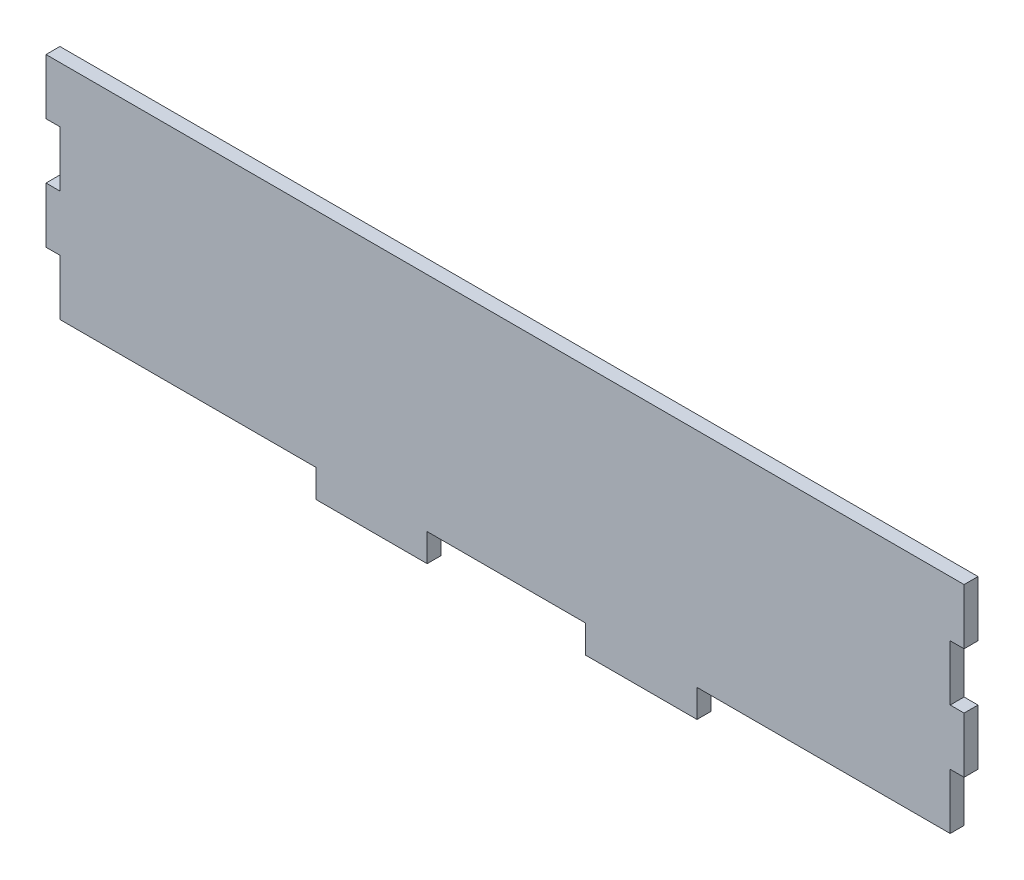
ISO-10303-21;
HEADER;
FILE_DESCRIPTION(('STEP AP214'),'2;1');
FILE_NAME('part.step','',(''),(''),'','','');
FILE_SCHEMA(('AUTOMOTIVE_DESIGN { 1 0 10303 214 1 1 1 1 }'));
ENDSEC;
DATA;
#1=APPLICATION_CONTEXT('core data for automotive mechanical design processes');
#2=APPLICATION_PROTOCOL_DEFINITION('international standard','automotive_design',2000,#1);
#3=PRODUCT_CONTEXT('',#1,'mechanical');
#4=PRODUCT('Part','Part','',(#3));
#5=PRODUCT_RELATED_PRODUCT_CATEGORY('part','',(#4));
#6=PRODUCT_DEFINITION_FORMATION('','',#4);
#7=PRODUCT_DEFINITION_CONTEXT('part definition',#1,'design');
#8=PRODUCT_DEFINITION('design','',#6,#7);
#9=PRODUCT_DEFINITION_SHAPE('','',#8);
#10=(LENGTH_UNIT() NAMED_UNIT(*) SI_UNIT(.MILLI.,.METRE.));
#11=(NAMED_UNIT(*) PLANE_ANGLE_UNIT() SI_UNIT($,.RADIAN.));
#12=(NAMED_UNIT(*) SI_UNIT($,.STERADIAN.) SOLID_ANGLE_UNIT());
#13=UNCERTAINTY_MEASURE_WITH_UNIT(LENGTH_MEASURE(1.E-05),#10,'distance_accuracy_value','');
#14=(GEOMETRIC_REPRESENTATION_CONTEXT(3) GLOBAL_UNCERTAINTY_ASSIGNED_CONTEXT((#13)) GLOBAL_UNIT_ASSIGNED_CONTEXT((#10,
#11,#12)) REPRESENTATION_CONTEXT('',''));
#15=CARTESIAN_POINT('',(0.,0.,0.));
#16=DIRECTION('',(0.,0.,1.));
#17=DIRECTION('',(1.,0.,0.));
#18=AXIS2_PLACEMENT_3D('',#15,#16,#17);
#19=CARTESIAN_POINT('',(101.6,-50.8,3.175));
#20=DIRECTION('',(-1.,0.,0.));
#21=DIRECTION('',(0.,0.,1.));
#22=AXIS2_PLACEMENT_3D('',#19,#20,#21);
#23=PLANE('',#22);
#24=DIRECTION('',(0.,1.,0.));
#25=VECTOR('',#24,1.);
#26=CARTESIAN_POINT('',(101.6,-50.8,0.));
#27=LINE('',#26,#25);
#28=CARTESIAN_POINT('',(101.599999999999,-25.3999999999999,0.));
#29=VERTEX_POINT('',#28);
#30=CARTESIAN_POINT('',(101.6,-12.6999999999999,0.));
#31=VERTEX_POINT('',#30);
#32=EDGE_CURVE('E55',#29,#31,#27,.T.);
#33=ORIENTED_EDGE('',*,*,#32,.T.);
#34=DIRECTION('',(0.,0.,1.));
#35=VECTOR('',#34,1.);
#36=CARTESIAN_POINT('',(101.599999999999,-12.6999999999999,0.));
#37=LINE('',#36,#35);
#38=CARTESIAN_POINT('',(101.6,-12.6999999999999,3.175));
#39=VERTEX_POINT('',#38);
#40=EDGE_CURVE('E50',#31,#39,#37,.T.);
#41=ORIENTED_EDGE('',*,*,#40,.T.);
#42=DIRECTION('',(0.,1.,0.));
#43=VECTOR('',#42,1.);
#44=CARTESIAN_POINT('',(101.6,-50.8,3.175));
#45=LINE('',#44,#43);
#46=CARTESIAN_POINT('',(101.6,-25.3999999999999,3.175));
#47=VERTEX_POINT('',#46);
#48=EDGE_CURVE('E220',#47,#39,#45,.T.);
#49=ORIENTED_EDGE('',*,*,#48,.F.);
#50=DIRECTION('',(0.,0.,1.));
#51=VECTOR('',#50,1.);
#52=CARTESIAN_POINT('',(101.599999999999,-25.3999999999999,0.));
#53=LINE('',#52,#51);
#54=EDGE_CURVE('E345',#29,#47,#53,.T.);
#55=ORIENTED_EDGE('',*,*,#54,.F.);
#56=EDGE_LOOP('',(#33,#41,#49,#55));
#57=FACE_BOUND('',#56,.T.);
#58=ADVANCED_FACE('F35',(#57),#23,.F.);
#59=CARTESIAN_POINT('',(-101.6,-50.8,3.175));
#60=DIRECTION('',(0.,1.,0.));
#61=DIRECTION('',(0.,0.,1.));
#62=AXIS2_PLACEMENT_3D('',#59,#60,#61);
#63=PLANE('',#62);
#64=DIRECTION('',(1.,0.,0.));
#65=VECTOR('',#64,1.);
#66=CARTESIAN_POINT('',(-101.6,-50.8,0.));
#67=LINE('',#66,#65);
#68=CARTESIAN_POINT('',(43.815,-50.8,0.));
#69=VERTEX_POINT('',#68);
#70=CARTESIAN_POINT('',(101.6,-50.8,0.));
#71=VERTEX_POINT('',#70);
#72=EDGE_CURVE('E214',#69,#71,#67,.T.);
#73=ORIENTED_EDGE('',*,*,#72,.T.);
#74=DIRECTION('',(0.,0.,-1.));
#75=VECTOR('',#74,1.);
#76=CARTESIAN_POINT('',(101.6,-50.8,3.175));
#77=LINE('',#76,#75);
#78=CARTESIAN_POINT('',(101.6,-50.8,3.175));
#79=VERTEX_POINT('',#78);
#80=EDGE_CURVE('E43',#79,#71,#77,.T.);
#81=ORIENTED_EDGE('',*,*,#80,.F.);
#82=DIRECTION('',(1.,0.,0.));
#83=VECTOR('',#82,1.);
#84=CARTESIAN_POINT('',(-101.6,-50.8,3.175));
#85=LINE('',#84,#83);
#86=CARTESIAN_POINT('',(43.815,-50.8,3.175));
#87=VERTEX_POINT('',#86);
#88=EDGE_CURVE('E194',#87,#79,#85,.T.);
#89=ORIENTED_EDGE('',*,*,#88,.F.);
#90=DIRECTION('',(0.,0.,1.));
#91=VECTOR('',#90,1.);
#92=CARTESIAN_POINT('',(43.815,-50.8,0.));
#93=LINE('',#92,#91);
#94=EDGE_CURVE('E369',#69,#87,#93,.T.);
#95=ORIENTED_EDGE('',*,*,#94,.F.);
#96=EDGE_LOOP('',(#73,#81,#89,#95));
#97=FACE_BOUND('',#96,.T.);
#98=ADVANCED_FACE('F213',(#97),#63,.F.);
#99=CARTESIAN_POINT('',(-17.78,-50.8,0.));
#100=VERTEX_POINT('',#99);
#101=CARTESIAN_POINT('',(18.415,-50.8,0.));
#102=VERTEX_POINT('',#101);
#103=EDGE_CURVE('E236',#100,#102,#67,.T.);
#104=ORIENTED_EDGE('',*,*,#103,.T.);
#105=DIRECTION('',(0.,0.,1.));
#106=VECTOR('',#105,1.);
#107=CARTESIAN_POINT('',(18.415,-50.8,0.));
#108=LINE('',#107,#106);
#109=CARTESIAN_POINT('',(18.415,-50.8,3.175));
#110=VERTEX_POINT('',#109);
#111=EDGE_CURVE('E380',#102,#110,#108,.T.);
#112=ORIENTED_EDGE('',*,*,#111,.T.);
#113=CARTESIAN_POINT('',(-17.78,-50.8,3.175));
#114=VERTEX_POINT('',#113);
#115=EDGE_CURVE('E208',#114,#110,#85,.T.);
#116=ORIENTED_EDGE('',*,*,#115,.F.);
#117=DIRECTION('',(0.,0.,1.));
#118=VECTOR('',#117,1.);
#119=CARTESIAN_POINT('',(-17.78,-50.8,0.));
#120=LINE('',#119,#118);
#121=EDGE_CURVE('E273',#100,#114,#120,.T.);
#122=ORIENTED_EDGE('',*,*,#121,.F.);
#123=EDGE_LOOP('',(#104,#112,#116,#122));
#124=FACE_BOUND('',#123,.T.);
#125=ADVANCED_FACE('F421',(#124),#63,.F.);
#126=CARTESIAN_POINT('',(-101.6,-50.8,3.175));
#127=DIRECTION('',(1.,0.,0.));
#128=DIRECTION('',(0.,0.,-1.));
#129=AXIS2_PLACEMENT_3D('',#126,#127,#128);
#130=PLANE('',#129);
#131=DIRECTION('',(0.,-1.,0.));
#132=VECTOR('',#131,1.);
#133=CARTESIAN_POINT('',(-101.6,-50.8,3.175));
#134=LINE('',#133,#132);
#135=CARTESIAN_POINT('',(-101.6,-38.1,3.175));
#136=VERTEX_POINT('',#135);
#137=CARTESIAN_POINT('',(-101.6,-50.8,3.175));
#138=VERTEX_POINT('',#137);
#139=EDGE_CURVE('E219',#136,#138,#134,.T.);
#140=ORIENTED_EDGE('',*,*,#139,.F.);
#141=DIRECTION('',(0.,0.,1.));
#142=VECTOR('',#141,1.);
#143=CARTESIAN_POINT('',(-101.599999999999,-38.1,0.));
#144=LINE('',#143,#142);
#145=CARTESIAN_POINT('',(-101.599999999999,-38.1,0.));
#146=VERTEX_POINT('',#145);
#147=EDGE_CURVE('E282',#146,#136,#144,.T.);
#148=ORIENTED_EDGE('',*,*,#147,.F.);
#149=DIRECTION('',(0.,-1.,0.));
#150=VECTOR('',#149,1.);
#151=CARTESIAN_POINT('',(-101.6,-50.8,0.));
#152=LINE('',#151,#150);
#153=CARTESIAN_POINT('',(-101.6,-50.8,0.));
#154=VERTEX_POINT('',#153);
#155=EDGE_CURVE('E232',#146,#154,#152,.T.);
#156=ORIENTED_EDGE('',*,*,#155,.T.);
#157=DIRECTION('',(0.,0.,-1.));
#158=VECTOR('',#157,1.);
#159=CARTESIAN_POINT('',(-101.6,-50.8,3.175));
#160=LINE('',#159,#158);
#161=EDGE_CURVE('E11',#138,#154,#160,.T.);
#162=ORIENTED_EDGE('',*,*,#161,.F.);
#163=EDGE_LOOP('',(#140,#148,#156,#162));
#164=FACE_BOUND('',#163,.T.);
#165=ADVANCED_FACE('F456',(#164),#130,.F.);
#166=CARTESIAN_POINT('',(-101.599999999999,-12.7,0.));
#167=VERTEX_POINT('',#166);
#168=CARTESIAN_POINT('',(-101.6,-25.4,0.));
#169=VERTEX_POINT('',#168);
#170=EDGE_CURVE('E235',#167,#169,#152,.T.);
#171=ORIENTED_EDGE('',*,*,#170,.T.);
#172=DIRECTION('',(0.,0.,1.));
#173=VECTOR('',#172,1.);
#174=CARTESIAN_POINT('',(-101.599999999999,-25.4,0.));
#175=LINE('',#174,#173);
#176=CARTESIAN_POINT('',(-101.6,-25.4,3.175));
#177=VERTEX_POINT('',#176);
#178=EDGE_CURVE('E243',#169,#177,#175,.T.);
#179=ORIENTED_EDGE('',*,*,#178,.T.);
#180=CARTESIAN_POINT('',(-101.6,-12.7,3.175));
#181=VERTEX_POINT('',#180);
#182=EDGE_CURVE('E209',#181,#177,#134,.T.);
#183=ORIENTED_EDGE('',*,*,#182,.F.);
#184=DIRECTION('',(0.,0.,1.));
#185=VECTOR('',#184,1.);
#186=CARTESIAN_POINT('',(-101.599999999999,-12.7,0.));
#187=LINE('',#186,#185);
#188=EDGE_CURVE('E246',#167,#181,#187,.T.);
#189=ORIENTED_EDGE('',*,*,#188,.F.);
#190=EDGE_LOOP('',(#171,#179,#183,#189));
#191=FACE_BOUND('',#190,.T.);
#192=ADVANCED_FACE('F242',(#191),#130,.F.);
#193=CARTESIAN_POINT('',(-43.18,-50.8,0.));
#194=VERTEX_POINT('',#193);
#195=EDGE_CURVE('E224',#154,#194,#67,.T.);
#196=ORIENTED_EDGE('',*,*,#195,.T.);
#197=DIRECTION('',(0.,0.,1.));
#198=VECTOR('',#197,1.);
#199=CARTESIAN_POINT('',(-43.18,-50.8,0.));
#200=LINE('',#199,#198);
#201=CARTESIAN_POINT('',(-43.18,-50.8,3.175));
#202=VERTEX_POINT('',#201);
#203=EDGE_CURVE('E402',#194,#202,#200,.T.);
#204=ORIENTED_EDGE('',*,*,#203,.T.);
#205=EDGE_CURVE('E211',#138,#202,#85,.T.);
#206=ORIENTED_EDGE('',*,*,#205,.F.);
#207=ORIENTED_EDGE('',*,*,#161,.T.);
#208=EDGE_LOOP('',(#196,#204,#206,#207));
#209=FACE_BOUND('',#208,.T.);
#210=ADVANCED_FACE('F460',(#209),#63,.F.);
#211=CARTESIAN_POINT('',(101.6,-38.0999999999999,0.));
#212=VERTEX_POINT('',#211);
#213=EDGE_CURVE('E230',#71,#212,#27,.T.);
#214=ORIENTED_EDGE('',*,*,#213,.T.);
#215=DIRECTION('',(0.,0.,1.));
#216=VECTOR('',#215,1.);
#217=CARTESIAN_POINT('',(101.599999999999,-38.0999999999999,0.));
#218=LINE('',#217,#216);
#219=CARTESIAN_POINT('',(101.6,-38.0999999999999,3.175));
#220=VERTEX_POINT('',#219);
#221=EDGE_CURVE('E218',#212,#220,#218,.T.);
#222=ORIENTED_EDGE('',*,*,#221,.T.);
#223=EDGE_CURVE('E200',#79,#220,#45,.T.);
#224=ORIENTED_EDGE('',*,*,#223,.F.);
#225=ORIENTED_EDGE('',*,*,#80,.T.);
#226=EDGE_LOOP('',(#214,#222,#224,#225));
#227=FACE_BOUND('',#226,.T.);
#228=ADVANCED_FACE('F37',(#227),#23,.F.);
#229=CARTESIAN_POINT('',(0.,0.,3.175));
#230=DIRECTION('',(0.,0.,-1.));
#231=DIRECTION('',(-1.,0.,0.));
#232=AXIS2_PLACEMENT_3D('',#229,#230,#231);
#233=PLANE('',#232);
#234=DIRECTION('',(0.,1.,0.));
#235=VECTOR('',#234,1.);
#236=CARTESIAN_POINT('',(104.774999999999,1.07552855510562E-13,3.175));
#237=LINE('',#236,#235);
#238=CARTESIAN_POINT('',(104.774999999999,-12.6999999999999,3.175));
#239=VERTEX_POINT('',#238);
#240=CARTESIAN_POINT('',(104.774999999999,1.07552855510562E-13,3.175));
#241=VERTEX_POINT('',#240);
#242=EDGE_CURVE('E317',#239,#241,#237,.T.);
#243=ORIENTED_EDGE('',*,*,#242,.T.);
#244=DIRECTION('',(-1.,0.,0.));
#245=VECTOR('',#244,1.);
#246=CARTESIAN_POINT('',(-101.599999999999,0.,3.175));
#247=LINE('',#246,#245);
#248=CARTESIAN_POINT('',(-104.774999999999,0.,3.175));
#249=VERTEX_POINT('',#248);
#250=EDGE_CURVE('E285',#241,#249,#247,.T.);
#251=ORIENTED_EDGE('',*,*,#250,.T.);
#252=DIRECTION('',(0.,-1.,0.));
#253=VECTOR('',#252,1.);
#254=CARTESIAN_POINT('',(-104.774999999999,0.,3.175));
#255=LINE('',#254,#253);
#256=CARTESIAN_POINT('',(-104.774999999999,-12.7,3.175));
#257=VERTEX_POINT('',#256);
#258=EDGE_CURVE('E300',#249,#257,#255,.T.);
#259=ORIENTED_EDGE('',*,*,#258,.T.);
#260=DIRECTION('',(1.,0.,0.));
#261=VECTOR('',#260,1.);
#262=CARTESIAN_POINT('',(-101.599999999999,-12.7,3.175));
#263=LINE('',#262,#261);
#264=EDGE_CURVE('E293',#257,#181,#263,.T.);
#265=ORIENTED_EDGE('',*,*,#264,.T.);
#266=ORIENTED_EDGE('',*,*,#182,.T.);
#267=DIRECTION('',(-1.,0.,0.));
#268=VECTOR('',#267,1.);
#269=CARTESIAN_POINT('',(-101.599999999999,-25.4,3.175));
#270=LINE('',#269,#268);
#271=CARTESIAN_POINT('',(-104.774999999999,-25.4,3.175));
#272=VERTEX_POINT('',#271);
#273=EDGE_CURVE('E257',#177,#272,#270,.T.);
#274=ORIENTED_EDGE('',*,*,#273,.T.);
#275=DIRECTION('',(0.,-1.,0.));
#276=VECTOR('',#275,1.);
#277=CARTESIAN_POINT('',(-104.774999999999,-25.4,3.175));
#278=LINE('',#277,#276);
#279=CARTESIAN_POINT('',(-104.774999999999,-38.1,3.175));
#280=VERTEX_POINT('',#279);
#281=EDGE_CURVE('E270',#272,#280,#278,.T.);
#282=ORIENTED_EDGE('',*,*,#281,.T.);
#283=DIRECTION('',(1.,0.,0.));
#284=VECTOR('',#283,1.);
#285=CARTESIAN_POINT('',(-101.599999999999,-38.1,3.175));
#286=LINE('',#285,#284);
#287=EDGE_CURVE('E266',#280,#136,#286,.T.);
#288=ORIENTED_EDGE('',*,*,#287,.T.);
#289=ORIENTED_EDGE('',*,*,#139,.T.);
#290=ORIENTED_EDGE('',*,*,#205,.T.);
#291=DIRECTION('',(0.,-1.,0.));
#292=VECTOR('',#291,1.);
#293=CARTESIAN_POINT('',(-43.18,-50.8,3.175));
#294=LINE('',#293,#292);
#295=CARTESIAN_POINT('',(-43.18,-57.15,3.175));
#296=VERTEX_POINT('',#295);
#297=EDGE_CURVE('E395',#202,#296,#294,.T.);
#298=ORIENTED_EDGE('',*,*,#297,.T.);
#299=DIRECTION('',(1.,0.,0.));
#300=VECTOR('',#299,1.);
#301=CARTESIAN_POINT('',(-17.78,-57.15,3.175));
#302=LINE('',#301,#300);
#303=CARTESIAN_POINT('',(-17.78,-57.15,3.175));
#304=VERTEX_POINT('',#303);
#305=EDGE_CURVE('E387',#296,#304,#302,.T.);
#306=ORIENTED_EDGE('',*,*,#305,.T.);
#307=DIRECTION('',(0.,1.,0.));
#308=VECTOR('',#307,1.);
#309=CARTESIAN_POINT('',(-17.78,-50.8,3.175));
#310=LINE('',#309,#308);
#311=EDGE_CURVE('E377',#304,#114,#310,.T.);
#312=ORIENTED_EDGE('',*,*,#311,.T.);
#313=ORIENTED_EDGE('',*,*,#115,.T.);
#314=DIRECTION('',(0.,-1.,0.));
#315=VECTOR('',#314,1.);
#316=CARTESIAN_POINT('',(18.415,-50.8,3.175));
#317=LINE('',#316,#315);
#318=CARTESIAN_POINT('',(18.415,-57.15,3.175));
#319=VERTEX_POINT('',#318);
#320=EDGE_CURVE('E371',#110,#319,#317,.T.);
#321=ORIENTED_EDGE('',*,*,#320,.T.);
#322=DIRECTION('',(1.,0.,0.));
#323=VECTOR('',#322,1.);
#324=CARTESIAN_POINT('',(43.815,-57.15,3.175));
#325=LINE('',#324,#323);
#326=CARTESIAN_POINT('',(43.815,-57.15,3.175));
#327=VERTEX_POINT('',#326);
#328=EDGE_CURVE('E363',#319,#327,#325,.T.);
#329=ORIENTED_EDGE('',*,*,#328,.T.);
#330=DIRECTION('',(0.,1.,0.));
#331=VECTOR('',#330,1.);
#332=CARTESIAN_POINT('',(43.815,-50.8,3.175));
#333=LINE('',#332,#331);
#334=EDGE_CURVE('E204',#327,#87,#333,.T.);
#335=ORIENTED_EDGE('',*,*,#334,.T.);
#336=ORIENTED_EDGE('',*,*,#88,.T.);
#337=ORIENTED_EDGE('',*,*,#223,.T.);
#338=DIRECTION('',(1.,0.,0.));
#339=VECTOR('',#338,1.);
#340=CARTESIAN_POINT('',(101.599999999999,-38.0999999999999,3.175));
#341=LINE('',#340,#339);
#342=CARTESIAN_POINT('',(104.774999999999,-38.0999999999999,3.175));
#343=VERTEX_POINT('',#342);
#344=EDGE_CURVE('E348',#220,#343,#341,.T.);
#345=ORIENTED_EDGE('',*,*,#344,.T.);
#346=DIRECTION('',(0.,1.,0.));
#347=VECTOR('',#346,1.);
#348=CARTESIAN_POINT('',(104.774999999999,-25.3999999999999,3.175));
#349=LINE('',#348,#347);
#350=CARTESIAN_POINT('',(104.774999999999,-25.3999999999999,3.175));
#351=VERTEX_POINT('',#350);
#352=EDGE_CURVE('E339',#343,#351,#349,.T.);
#353=ORIENTED_EDGE('',*,*,#352,.T.);
#354=DIRECTION('',(-1.,0.,0.));
#355=VECTOR('',#354,1.);
#356=CARTESIAN_POINT('',(101.599999999999,-25.3999999999999,3.175));
#357=LINE('',#356,#355);
#358=EDGE_CURVE('E331',#351,#47,#357,.T.);
#359=ORIENTED_EDGE('',*,*,#358,.T.);
#360=ORIENTED_EDGE('',*,*,#48,.T.);
#361=DIRECTION('',(1.,0.,0.));
#362=VECTOR('',#361,1.);
#363=CARTESIAN_POINT('',(101.599999999999,-12.6999999999999,3.175));
#364=LINE('',#363,#362);
#365=EDGE_CURVE('E319',#39,#239,#364,.T.);
#366=ORIENTED_EDGE('',*,*,#365,.T.);
#367=EDGE_LOOP('',(#243,#251,#259,#265,#266,#274,#282,#288,#289,#290,#298,#306,#312,#313,#321,
#329,#335,#336,#337,#345,#353,#359,#360,#366));
#368=FACE_BOUND('',#367,.T.);
#369=ADVANCED_FACE('F197',(#368),#233,.F.);
#370=CARTESIAN_POINT('',(0.,0.,0.));
#371=DIRECTION('',(0.,0.,-1.));
#372=DIRECTION('',(-1.,0.,0.));
#373=AXIS2_PLACEMENT_3D('',#370,#371,#372);
#374=PLANE('',#373);
#375=DIRECTION('',(-1.,0.,0.));
#376=VECTOR('',#375,1.);
#377=CARTESIAN_POINT('',(-101.599999999999,0.,0.));
#378=LINE('',#377,#376);
#379=CARTESIAN_POINT('',(104.774999999999,1.07552855510562E-13,0.));
#380=VERTEX_POINT('',#379);
#381=CARTESIAN_POINT('',(-104.774999999999,0.,0.));
#382=VERTEX_POINT('',#381);
#383=EDGE_CURVE('E289',#380,#382,#378,.T.);
#384=ORIENTED_EDGE('',*,*,#383,.F.);
#385=DIRECTION('',(0.,1.,0.));
#386=VECTOR('',#385,1.);
#387=CARTESIAN_POINT('',(104.774999999999,1.07552855510562E-13,0.));
#388=LINE('',#387,#386);
#389=CARTESIAN_POINT('',(104.774999999999,-12.6999999999999,0.));
#390=VERTEX_POINT('',#389);
#391=EDGE_CURVE('E324',#390,#380,#388,.T.);
#392=ORIENTED_EDGE('',*,*,#391,.F.);
#393=DIRECTION('',(1.,0.,0.));
#394=VECTOR('',#393,1.);
#395=CARTESIAN_POINT('',(101.599999999999,-12.6999999999999,0.));
#396=LINE('',#395,#394);
#397=EDGE_CURVE('E321',#31,#390,#396,.T.);
#398=ORIENTED_EDGE('',*,*,#397,.F.);
#399=ORIENTED_EDGE('',*,*,#32,.F.);
#400=DIRECTION('',(-1.,0.,0.));
#401=VECTOR('',#400,1.);
#402=CARTESIAN_POINT('',(101.599999999999,-25.3999999999999,0.));
#403=LINE('',#402,#401);
#404=CARTESIAN_POINT('',(104.774999999999,-25.3999999999999,0.));
#405=VERTEX_POINT('',#404);
#406=EDGE_CURVE('E335',#405,#29,#403,.T.);
#407=ORIENTED_EDGE('',*,*,#406,.F.);
#408=DIRECTION('',(0.,1.,0.));
#409=VECTOR('',#408,1.);
#410=CARTESIAN_POINT('',(104.774999999999,-25.3999999999999,0.));
#411=LINE('',#410,#409);
#412=CARTESIAN_POINT('',(104.774999999999,-38.0999999999999,0.));
#413=VERTEX_POINT('',#412);
#414=EDGE_CURVE('E342',#413,#405,#411,.T.);
#415=ORIENTED_EDGE('',*,*,#414,.F.);
#416=DIRECTION('',(1.,0.,0.));
#417=VECTOR('',#416,1.);
#418=CARTESIAN_POINT('',(101.599999999999,-38.0999999999999,0.));
#419=LINE('',#418,#417);
#420=EDGE_CURVE('E338',#212,#413,#419,.T.);
#421=ORIENTED_EDGE('',*,*,#420,.F.);
#422=ORIENTED_EDGE('',*,*,#213,.F.);
#423=ORIENTED_EDGE('',*,*,#72,.F.);
#424=DIRECTION('',(0.,1.,0.));
#425=VECTOR('',#424,1.);
#426=CARTESIAN_POINT('',(43.815,-50.8,0.));
#427=LINE('',#426,#425);
#428=CARTESIAN_POINT('',(43.815,-57.15,0.));
#429=VERTEX_POINT('',#428);
#430=EDGE_CURVE('E359',#429,#69,#427,.T.);
#431=ORIENTED_EDGE('',*,*,#430,.F.);
#432=DIRECTION('',(1.,0.,0.));
#433=VECTOR('',#432,1.);
#434=CARTESIAN_POINT('',(43.815,-57.15,0.));
#435=LINE('',#434,#433);
#436=CARTESIAN_POINT('',(18.415,-57.15,0.));
#437=VERTEX_POINT('',#436);
#438=EDGE_CURVE('E366',#437,#429,#435,.T.);
#439=ORIENTED_EDGE('',*,*,#438,.F.);
#440=DIRECTION('',(0.,-1.,0.));
#441=VECTOR('',#440,1.);
#442=CARTESIAN_POINT('',(18.415,-50.8,0.));
#443=LINE('',#442,#441);
#444=EDGE_CURVE('E362',#102,#437,#443,.T.);
#445=ORIENTED_EDGE('',*,*,#444,.F.);
#446=ORIENTED_EDGE('',*,*,#103,.F.);
#447=DIRECTION('',(0.,1.,0.));
#448=VECTOR('',#447,1.);
#449=CARTESIAN_POINT('',(-17.78,-50.8,0.));
#450=LINE('',#449,#448);
#451=CARTESIAN_POINT('',(-17.78,-57.15,0.));
#452=VERTEX_POINT('',#451);
#453=EDGE_CURVE('E383',#452,#100,#450,.T.);
#454=ORIENTED_EDGE('',*,*,#453,.F.);
#455=DIRECTION('',(1.,0.,0.));
#456=VECTOR('',#455,1.);
#457=CARTESIAN_POINT('',(-17.78,-57.15,0.));
#458=LINE('',#457,#456);
#459=CARTESIAN_POINT('',(-43.18,-57.15,0.));
#460=VERTEX_POINT('',#459);
#461=EDGE_CURVE('E390',#460,#452,#458,.T.);
#462=ORIENTED_EDGE('',*,*,#461,.F.);
#463=DIRECTION('',(0.,-1.,0.));
#464=VECTOR('',#463,1.);
#465=CARTESIAN_POINT('',(-43.18,-50.8,0.));
#466=LINE('',#465,#464);
#467=EDGE_CURVE('E386',#194,#460,#466,.T.);
#468=ORIENTED_EDGE('',*,*,#467,.F.);
#469=ORIENTED_EDGE('',*,*,#195,.F.);
#470=ORIENTED_EDGE('',*,*,#155,.F.);
#471=DIRECTION('',(1.,0.,0.));
#472=VECTOR('',#471,1.);
#473=CARTESIAN_POINT('',(-101.599999999999,-38.1,0.));
#474=LINE('',#473,#472);
#475=CARTESIAN_POINT('',(-104.774999999999,-38.1,0.));
#476=VERTEX_POINT('',#475);
#477=EDGE_CURVE('E259',#476,#146,#474,.T.);
#478=ORIENTED_EDGE('',*,*,#477,.F.);
#479=DIRECTION('',(0.,-1.,0.));
#480=VECTOR('',#479,1.);
#481=CARTESIAN_POINT('',(-104.774999999999,-25.4,0.));
#482=LINE('',#481,#480);
#483=CARTESIAN_POINT('',(-104.774999999999,-25.4,0.));
#484=VERTEX_POINT('',#483);
#485=EDGE_CURVE('E265',#484,#476,#482,.T.);
#486=ORIENTED_EDGE('',*,*,#485,.F.);
#487=DIRECTION('',(-1.,0.,0.));
#488=VECTOR('',#487,1.);
#489=CARTESIAN_POINT('',(-101.599999999999,-25.4,0.));
#490=LINE('',#489,#488);
#491=EDGE_CURVE('E255',#169,#484,#490,.T.);
#492=ORIENTED_EDGE('',*,*,#491,.F.);
#493=ORIENTED_EDGE('',*,*,#170,.F.);
#494=DIRECTION('',(1.,0.,0.));
#495=VECTOR('',#494,1.);
#496=CARTESIAN_POINT('',(-101.599999999999,-12.7,0.));
#497=LINE('',#496,#495);
#498=CARTESIAN_POINT('',(-104.774999999999,-12.7,0.));
#499=VERTEX_POINT('',#498);
#500=EDGE_CURVE('E296',#499,#167,#497,.T.);
#501=ORIENTED_EDGE('',*,*,#500,.F.);
#502=DIRECTION('',(0.,-1.,0.));
#503=VECTOR('',#502,1.);
#504=CARTESIAN_POINT('',(-104.774999999999,0.,0.));
#505=LINE('',#504,#503);
#506=EDGE_CURVE('E292',#382,#499,#505,.T.);
#507=ORIENTED_EDGE('',*,*,#506,.F.);
#508=EDGE_LOOP('',(#384,#392,#398,#399,#407,#415,#421,#422,#423,#431,#439,#445,#446,#454,#462,
#468,#469,#470,#478,#486,#492,#493,#501,#507));
#509=FACE_BOUND('',#508,.T.);
#510=ADVANCED_FACE('F262',(#509),#374,.T.);
#511=CARTESIAN_POINT('',(-101.599999999999,-12.7,0.));
#512=DIRECTION('',(0.,-1.,0.));
#513=DIRECTION('',(0.,0.,-1.));
#514=AXIS2_PLACEMENT_3D('',#511,#512,#513);
#515=PLANE('',#514);
#516=ORIENTED_EDGE('',*,*,#264,.F.);
#517=DIRECTION('',(0.,0.,1.));
#518=VECTOR('',#517,1.);
#519=CARTESIAN_POINT('',(-104.774999999999,-12.7,0.));
#520=LINE('',#519,#518);
#521=EDGE_CURVE('E305',#499,#257,#520,.T.);
#522=ORIENTED_EDGE('',*,*,#521,.F.);
#523=ORIENTED_EDGE('',*,*,#500,.T.);
#524=ORIENTED_EDGE('',*,*,#188,.T.);
#525=EDGE_LOOP('',(#516,#522,#523,#524));
#526=FACE_BOUND('',#525,.T.);
#527=ADVANCED_FACE('F448',(#526),#515,.T.);
#528=CARTESIAN_POINT('',(-104.774999999999,0.,0.));
#529=DIRECTION('',(-1.,0.,0.));
#530=DIRECTION('',(0.,0.,1.));
#531=AXIS2_PLACEMENT_3D('',#528,#529,#530);
#532=PLANE('',#531);
#533=ORIENTED_EDGE('',*,*,#258,.F.);
#534=DIRECTION('',(0.,0.,1.));
#535=VECTOR('',#534,1.);
#536=CARTESIAN_POINT('',(-104.774999999999,0.,0.));
#537=LINE('',#536,#535);
#538=EDGE_CURVE('E226',#382,#249,#537,.T.);
#539=ORIENTED_EDGE('',*,*,#538,.F.);
#540=ORIENTED_EDGE('',*,*,#506,.T.);
#541=ORIENTED_EDGE('',*,*,#521,.T.);
#542=EDGE_LOOP('',(#533,#539,#540,#541));
#543=FACE_BOUND('',#542,.T.);
#544=ADVANCED_FACE('F313',(#543),#532,.T.);
#545=CARTESIAN_POINT('',(-101.599999999999,0.,0.));
#546=DIRECTION('',(0.,1.,0.));
#547=DIRECTION('',(0.,0.,1.));
#548=AXIS2_PLACEMENT_3D('',#545,#546,#547);
#549=PLANE('',#548);
#550=ORIENTED_EDGE('',*,*,#250,.F.);
#551=DIRECTION('',(0.,0.,1.));
#552=VECTOR('',#551,1.);
#553=CARTESIAN_POINT('',(104.774999999999,1.07552855510562E-13,0.));
#554=LINE('',#553,#552);
#555=EDGE_CURVE('E329',#380,#241,#554,.T.);
#556=ORIENTED_EDGE('',*,*,#555,.F.);
#557=ORIENTED_EDGE('',*,*,#383,.T.);
#558=ORIENTED_EDGE('',*,*,#538,.T.);
#559=EDGE_LOOP('',(#550,#556,#557,#558));
#560=FACE_BOUND('',#559,.T.);
#561=ADVANCED_FACE('F309',(#560),#549,.T.);
#562=CARTESIAN_POINT('',(-101.599999999999,-38.1,0.));
#563=DIRECTION('',(0.,-1.,0.));
#564=DIRECTION('',(0.,0.,-1.));
#565=AXIS2_PLACEMENT_3D('',#562,#563,#564);
#566=PLANE('',#565);
#567=ORIENTED_EDGE('',*,*,#287,.F.);
#568=DIRECTION('',(0.,0.,1.));
#569=VECTOR('',#568,1.);
#570=CARTESIAN_POINT('',(-104.774999999999,-38.1,0.));
#571=LINE('',#570,#569);
#572=EDGE_CURVE('E286',#476,#280,#571,.T.);
#573=ORIENTED_EDGE('',*,*,#572,.F.);
#574=ORIENTED_EDGE('',*,*,#477,.T.);
#575=ORIENTED_EDGE('',*,*,#147,.T.);
#576=EDGE_LOOP('',(#567,#573,#574,#575));
#577=FACE_BOUND('',#576,.T.);
#578=ADVANCED_FACE('F453',(#577),#566,.T.);
#579=CARTESIAN_POINT('',(-104.774999999999,-25.4,0.));
#580=DIRECTION('',(-1.,0.,0.));
#581=DIRECTION('',(0.,0.,1.));
#582=AXIS2_PLACEMENT_3D('',#579,#580,#581);
#583=PLANE('',#582);
#584=ORIENTED_EDGE('',*,*,#281,.F.);
#585=DIRECTION('',(0.,0.,1.));
#586=VECTOR('',#585,1.);
#587=CARTESIAN_POINT('',(-104.774999999999,-25.4,0.));
#588=LINE('',#587,#586);
#589=EDGE_CURVE('E258',#484,#272,#588,.T.);
#590=ORIENTED_EDGE('',*,*,#589,.F.);
#591=ORIENTED_EDGE('',*,*,#485,.T.);
#592=ORIENTED_EDGE('',*,*,#572,.T.);
#593=EDGE_LOOP('',(#584,#590,#591,#592));
#594=FACE_BOUND('',#593,.T.);
#595=ADVANCED_FACE('F520',(#594),#583,.T.);
#596=CARTESIAN_POINT('',(-101.599999999999,-25.4,0.));
#597=DIRECTION('',(0.,1.,0.));
#598=DIRECTION('',(0.,0.,1.));
#599=AXIS2_PLACEMENT_3D('',#596,#597,#598);
#600=PLANE('',#599);
#601=ORIENTED_EDGE('',*,*,#273,.F.);
#602=ORIENTED_EDGE('',*,*,#178,.F.);
#603=ORIENTED_EDGE('',*,*,#491,.T.);
#604=ORIENTED_EDGE('',*,*,#589,.T.);
#605=EDGE_LOOP('',(#601,#602,#603,#604));
#606=FACE_BOUND('',#605,.T.);
#607=ADVANCED_FACE('F254',(#606),#600,.T.);
#608=CARTESIAN_POINT('',(-17.78,-50.8,0.));
#609=DIRECTION('',(1.,0.,0.));
#610=DIRECTION('',(0.,0.,-1.));
#611=AXIS2_PLACEMENT_3D('',#608,#609,#610);
#612=PLANE('',#611);
#613=ORIENTED_EDGE('',*,*,#311,.F.);
#614=DIRECTION('',(0.,0.,1.));
#615=VECTOR('',#614,1.);
#616=CARTESIAN_POINT('',(-17.78,-57.15,0.));
#617=LINE('',#616,#615);
#618=EDGE_CURVE('E279',#452,#304,#617,.T.);
#619=ORIENTED_EDGE('',*,*,#618,.F.);
#620=ORIENTED_EDGE('',*,*,#453,.T.);
#621=ORIENTED_EDGE('',*,*,#121,.T.);
#622=EDGE_LOOP('',(#613,#619,#620,#621));
#623=FACE_BOUND('',#622,.T.);
#624=ADVANCED_FACE('F407',(#623),#612,.T.);
#625=CARTESIAN_POINT('',(-17.78,-57.15,0.));
#626=DIRECTION('',(0.,-1.,0.));
#627=DIRECTION('',(1.,0.,0.));
#628=AXIS2_PLACEMENT_3D('',#625,#626,#627);
#629=PLANE('',#628);
#630=ORIENTED_EDGE('',*,*,#305,.F.);
#631=DIRECTION('',(0.,0.,1.));
#632=VECTOR('',#631,1.);
#633=CARTESIAN_POINT('',(-43.18,-57.15,0.));
#634=LINE('',#633,#632);
#635=EDGE_CURVE('E401',#460,#296,#634,.T.);
#636=ORIENTED_EDGE('',*,*,#635,.F.);
#637=ORIENTED_EDGE('',*,*,#461,.T.);
#638=ORIENTED_EDGE('',*,*,#618,.T.);
#639=EDGE_LOOP('',(#630,#636,#637,#638));
#640=FACE_BOUND('',#639,.T.);
#641=ADVANCED_FACE('F415',(#640),#629,.T.);
#642=CARTESIAN_POINT('',(-43.18,-50.8,0.));
#643=DIRECTION('',(-1.,0.,0.));
#644=DIRECTION('',(0.,0.,1.));
#645=AXIS2_PLACEMENT_3D('',#642,#643,#644);
#646=PLANE('',#645);
#647=ORIENTED_EDGE('',*,*,#297,.F.);
#648=ORIENTED_EDGE('',*,*,#203,.F.);
#649=ORIENTED_EDGE('',*,*,#467,.T.);
#650=ORIENTED_EDGE('',*,*,#635,.T.);
#651=EDGE_LOOP('',(#647,#648,#649,#650));
#652=FACE_BOUND('',#651,.T.);
#653=ADVANCED_FACE('F459',(#652),#646,.T.);
#654=CARTESIAN_POINT('',(43.815,-50.8,0.));
#655=DIRECTION('',(1.,0.,0.));
#656=DIRECTION('',(0.,0.,-1.));
#657=AXIS2_PLACEMENT_3D('',#654,#655,#656);
#658=PLANE('',#657);
#659=ORIENTED_EDGE('',*,*,#334,.F.);
#660=DIRECTION('',(0.,0.,1.));
#661=VECTOR('',#660,1.);
#662=CARTESIAN_POINT('',(43.815,-57.15,0.));
#663=LINE('',#662,#661);
#664=EDGE_CURVE('E375',#429,#327,#663,.T.);
#665=ORIENTED_EDGE('',*,*,#664,.F.);
#666=ORIENTED_EDGE('',*,*,#430,.T.);
#667=ORIENTED_EDGE('',*,*,#94,.T.);
#668=EDGE_LOOP('',(#659,#665,#666,#667));
#669=FACE_BOUND('',#668,.T.);
#670=ADVANCED_FACE('F429',(#669),#658,.T.);
#671=CARTESIAN_POINT('',(43.815,-57.15,0.));
#672=DIRECTION('',(0.,-1.,0.));
#673=DIRECTION('',(1.,0.,0.));
#674=AXIS2_PLACEMENT_3D('',#671,#672,#673);
#675=PLANE('',#674);
#676=ORIENTED_EDGE('',*,*,#328,.F.);
#677=DIRECTION('',(0.,0.,1.));
#678=VECTOR('',#677,1.);
#679=CARTESIAN_POINT('',(18.415,-57.15,0.));
#680=LINE('',#679,#678);
#681=EDGE_CURVE('E378',#437,#319,#680,.T.);
#682=ORIENTED_EDGE('',*,*,#681,.F.);
#683=ORIENTED_EDGE('',*,*,#438,.T.);
#684=ORIENTED_EDGE('',*,*,#664,.T.);
#685=EDGE_LOOP('',(#676,#682,#683,#684));
#686=FACE_BOUND('',#685,.T.);
#687=ADVANCED_FACE('F426',(#686),#675,.T.);
#688=CARTESIAN_POINT('',(18.415,-50.8,0.));
#689=DIRECTION('',(-1.,0.,0.));
#690=DIRECTION('',(0.,0.,1.));
#691=AXIS2_PLACEMENT_3D('',#688,#689,#690);
#692=PLANE('',#691);
#693=ORIENTED_EDGE('',*,*,#320,.F.);
#694=ORIENTED_EDGE('',*,*,#111,.F.);
#695=ORIENTED_EDGE('',*,*,#444,.T.);
#696=ORIENTED_EDGE('',*,*,#681,.T.);
#697=EDGE_LOOP('',(#693,#694,#695,#696));
#698=FACE_BOUND('',#697,.T.);
#699=ADVANCED_FACE('F423',(#698),#692,.T.);
#700=CARTESIAN_POINT('',(101.599999999999,-25.3999999999999,0.));
#701=DIRECTION('',(0.,1.,0.));
#702=DIRECTION('',(0.,0.,1.));
#703=AXIS2_PLACEMENT_3D('',#700,#701,#702);
#704=PLANE('',#703);
#705=ORIENTED_EDGE('',*,*,#358,.F.);
#706=DIRECTION('',(0.,0.,1.));
#707=VECTOR('',#706,1.);
#708=CARTESIAN_POINT('',(104.774999999999,-25.3999999999999,0.));
#709=LINE('',#708,#707);
#710=EDGE_CURVE('E352',#405,#351,#709,.T.);
#711=ORIENTED_EDGE('',*,*,#710,.F.);
#712=ORIENTED_EDGE('',*,*,#406,.T.);
#713=ORIENTED_EDGE('',*,*,#54,.T.);
#714=EDGE_LOOP('',(#705,#711,#712,#713));
#715=FACE_BOUND('',#714,.T.);
#716=ADVANCED_FACE('F440',(#715),#704,.T.);
#717=CARTESIAN_POINT('',(104.774999999999,-25.3999999999999,0.));
#718=DIRECTION('',(1.,0.,0.));
#719=DIRECTION('',(0.,0.,-1.));
#720=AXIS2_PLACEMENT_3D('',#717,#718,#719);
#721=PLANE('',#720);
#722=ORIENTED_EDGE('',*,*,#352,.F.);
#723=DIRECTION('',(0.,0.,1.));
#724=VECTOR('',#723,1.);
#725=CARTESIAN_POINT('',(104.774999999999,-38.0999999999999,0.));
#726=LINE('',#725,#724);
#727=EDGE_CURVE('E354',#413,#343,#726,.T.);
#728=ORIENTED_EDGE('',*,*,#727,.F.);
#729=ORIENTED_EDGE('',*,*,#414,.T.);
#730=ORIENTED_EDGE('',*,*,#710,.T.);
#731=EDGE_LOOP('',(#722,#728,#729,#730));
#732=FACE_BOUND('',#731,.T.);
#733=ADVANCED_FACE('F436',(#732),#721,.T.);
#734=CARTESIAN_POINT('',(101.599999999999,-38.0999999999999,0.));
#735=DIRECTION('',(0.,-1.,0.));
#736=DIRECTION('',(0.,0.,-1.));
#737=AXIS2_PLACEMENT_3D('',#734,#735,#736);
#738=PLANE('',#737);
#739=ORIENTED_EDGE('',*,*,#344,.F.);
#740=ORIENTED_EDGE('',*,*,#221,.F.);
#741=ORIENTED_EDGE('',*,*,#420,.T.);
#742=ORIENTED_EDGE('',*,*,#727,.T.);
#743=EDGE_LOOP('',(#739,#740,#741,#742));
#744=FACE_BOUND('',#743,.T.);
#745=ADVANCED_FACE('F433',(#744),#738,.T.);
#746=CARTESIAN_POINT('',(104.774999999999,1.07552855510562E-13,0.));
#747=DIRECTION('',(1.,0.,0.));
#748=DIRECTION('',(0.,0.,-1.));
#749=AXIS2_PLACEMENT_3D('',#746,#747,#748);
#750=PLANE('',#749);
#751=ORIENTED_EDGE('',*,*,#242,.F.);
#752=DIRECTION('',(0.,0.,1.));
#753=VECTOR('',#752,1.);
#754=CARTESIAN_POINT('',(104.774999999999,-12.6999999999999,0.));
#755=LINE('',#754,#753);
#756=EDGE_CURVE('E332',#390,#239,#755,.T.);
#757=ORIENTED_EDGE('',*,*,#756,.F.);
#758=ORIENTED_EDGE('',*,*,#391,.T.);
#759=ORIENTED_EDGE('',*,*,#555,.T.);
#760=EDGE_LOOP('',(#751,#757,#758,#759));
#761=FACE_BOUND('',#760,.T.);
#762=ADVANCED_FACE('F446',(#761),#750,.T.);
#763=CARTESIAN_POINT('',(101.599999999999,-12.6999999999999,0.));
#764=DIRECTION('',(0.,-1.,0.));
#765=DIRECTION('',(1.,0.,0.));
#766=AXIS2_PLACEMENT_3D('',#763,#764,#765);
#767=PLANE('',#766);
#768=ORIENTED_EDGE('',*,*,#365,.F.);
#769=ORIENTED_EDGE('',*,*,#40,.F.);
#770=ORIENTED_EDGE('',*,*,#397,.T.);
#771=ORIENTED_EDGE('',*,*,#756,.T.);
#772=EDGE_LOOP('',(#768,#769,#770,#771));
#773=FACE_BOUND('',#772,.T.);
#774=ADVANCED_FACE('F442',(#773),#767,.T.);
#775=CLOSED_SHELL('',(#58,#98,#125,#165,#192,#210,#228,#369,#510,#527,#544,#561,#578,#595,#607,
#624,#641,#653,#670,#687,#699,#716,#733,#745,#762,#774));
#776=MANIFOLD_SOLID_BREP('B2',#775);
#777=ADVANCED_BREP_SHAPE_REPRESENTATION('',(#18,#776),#14);
#778=SHAPE_DEFINITION_REPRESENTATION(#9,#777);
ENDSEC;
END-ISO-10303-21;
